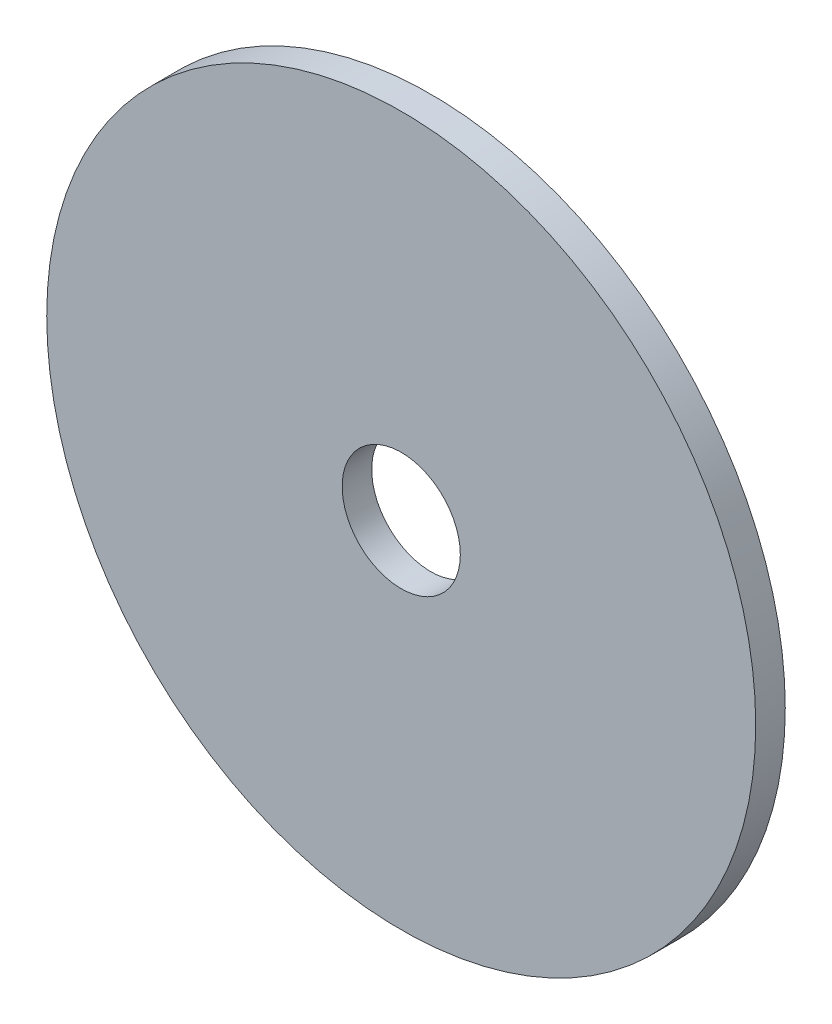
ISO-10303-21;
HEADER;
FILE_DESCRIPTION(('STEP AP214'),'2;1');
FILE_NAME('part.step','',(''),(''),'','','');
FILE_SCHEMA(('AUTOMOTIVE_DESIGN { 1 0 10303 214 1 1 1 1 }'));
ENDSEC;
DATA;
#1=APPLICATION_CONTEXT('core data for automotive mechanical design processes');
#2=APPLICATION_PROTOCOL_DEFINITION('international standard','automotive_design',2000,#1);
#3=PRODUCT_CONTEXT('',#1,'mechanical');
#4=PRODUCT('Part','Part','',(#3));
#5=PRODUCT_RELATED_PRODUCT_CATEGORY('part','',(#4));
#6=PRODUCT_DEFINITION_FORMATION('','',#4);
#7=PRODUCT_DEFINITION_CONTEXT('part definition',#1,'design');
#8=PRODUCT_DEFINITION('design','',#6,#7);
#9=PRODUCT_DEFINITION_SHAPE('','',#8);
#10=(LENGTH_UNIT() NAMED_UNIT(*) SI_UNIT(.MILLI.,.METRE.));
#11=(NAMED_UNIT(*) PLANE_ANGLE_UNIT() SI_UNIT($,.RADIAN.));
#12=(NAMED_UNIT(*) SI_UNIT($,.STERADIAN.) SOLID_ANGLE_UNIT());
#13=UNCERTAINTY_MEASURE_WITH_UNIT(LENGTH_MEASURE(1.E-05),#10,'distance_accuracy_value','');
#14=(GEOMETRIC_REPRESENTATION_CONTEXT(3) GLOBAL_UNCERTAINTY_ASSIGNED_CONTEXT((#13)) GLOBAL_UNIT_ASSIGNED_CONTEXT((#10,
#11,#12)) REPRESENTATION_CONTEXT('',''));
#15=CARTESIAN_POINT('',(0.,0.,0.));
#16=DIRECTION('',(0.,0.,1.));
#17=DIRECTION('',(1.,0.,0.));
#18=AXIS2_PLACEMENT_3D('',#15,#16,#17);
#19=CARTESIAN_POINT('',(0.,0.,3.175));
#20=DIRECTION('',(0.,0.,-1.));
#21=DIRECTION('',(-1.,0.,0.));
#22=AXIS2_PLACEMENT_3D('',#19,#20,#21);
#23=CYLINDRICAL_SURFACE('',#22,38.1);
#24=CARTESIAN_POINT('',(0.,0.,3.175));
#25=DIRECTION('',(0.,0.,1.));
#26=DIRECTION('',(1.,0.,0.));
#27=AXIS2_PLACEMENT_3D('',#24,#25,#26);
#28=CIRCLE('',#27,38.1);
#29=CARTESIAN_POINT('',(38.1,0.,3.175));
#30=VERTEX_POINT('',#29);
#31=EDGE_CURVE('E10',#30,#30,#28,.T.);
#32=ORIENTED_EDGE('',*,*,#31,.F.);
#33=EDGE_LOOP('',(#32));
#34=FACE_BOUND('',#33,.T.);
#35=CARTESIAN_POINT('',(0.,0.,0.));
#36=DIRECTION('',(0.,0.,1.));
#37=DIRECTION('',(1.,0.,0.));
#38=AXIS2_PLACEMENT_3D('',#35,#36,#37);
#39=CIRCLE('',#38,38.1);
#40=CARTESIAN_POINT('',(38.1,0.,0.));
#41=VERTEX_POINT('',#40);
#42=EDGE_CURVE('E40',#41,#41,#39,.T.);
#43=ORIENTED_EDGE('',*,*,#42,.T.);
#44=EDGE_LOOP('',(#43));
#45=FACE_BOUND('',#44,.T.);
#46=ADVANCED_FACE('F37',(#34,#45),#23,.T.);
#47=CARTESIAN_POINT('',(0.,0.,3.175));
#48=DIRECTION('',(0.,0.,1.));
#49=DIRECTION('',(1.,0.,0.));
#50=AXIS2_PLACEMENT_3D('',#47,#48,#49);
#51=PLANE('',#50);
#52=CARTESIAN_POINT('',(0.,0.,3.175));
#53=DIRECTION('',(0.,0.,1.));
#54=DIRECTION('',(1.,0.,0.));
#55=AXIS2_PLACEMENT_3D('',#52,#53,#54);
#56=CIRCLE('',#55,6.35);
#57=CARTESIAN_POINT('',(6.35,0.,3.175));
#58=VERTEX_POINT('',#57);
#59=EDGE_CURVE('E54',#58,#58,#56,.T.);
#60=ORIENTED_EDGE('',*,*,#59,.F.);
#61=EDGE_LOOP('',(#60));
#62=FACE_BOUND('',#61,.T.);
#63=ORIENTED_EDGE('',*,*,#31,.T.);
#64=EDGE_LOOP('',(#63));
#65=FACE_BOUND('',#64,.T.);
#66=ADVANCED_FACE('F62',(#62,#65),#51,.T.);
#67=CARTESIAN_POINT('',(0.,0.,0.));
#68=DIRECTION('',(0.,0.,1.));
#69=DIRECTION('',(1.,0.,0.));
#70=AXIS2_PLACEMENT_3D('',#67,#68,#69);
#71=PLANE('',#70);
#72=CARTESIAN_POINT('',(0.,0.,0.));
#73=DIRECTION('',(0.,0.,1.));
#74=DIRECTION('',(1.,0.,0.));
#75=AXIS2_PLACEMENT_3D('',#72,#73,#74);
#76=CIRCLE('',#75,6.35);
#77=CARTESIAN_POINT('',(6.35,0.,0.));
#78=VERTEX_POINT('',#77);
#79=EDGE_CURVE('E49',#78,#78,#76,.F.);
#80=ORIENTED_EDGE('',*,*,#79,.F.);
#81=EDGE_LOOP('',(#80));
#82=FACE_BOUND('',#81,.T.);
#83=ORIENTED_EDGE('',*,*,#42,.F.);
#84=EDGE_LOOP('',(#83));
#85=FACE_BOUND('',#84,.T.);
#86=ADVANCED_FACE('F64',(#82,#85),#71,.F.);
#87=CARTESIAN_POINT('',(0.,0.,-0.00100000000000013));
#88=DIRECTION('',(0.,0.,1.));
#89=DIRECTION('',(1.,0.,0.));
#90=AXIS2_PLACEMENT_3D('',#87,#88,#89);
#91=CYLINDRICAL_SURFACE('',#90,6.35);
#92=ORIENTED_EDGE('',*,*,#59,.T.);
#93=EDGE_LOOP('',(#92));
#94=FACE_BOUND('',#93,.T.);
#95=ORIENTED_EDGE('',*,*,#79,.T.);
#96=EDGE_LOOP('',(#95));
#97=FACE_BOUND('',#96,.T.);
#98=ADVANCED_FACE('F59',(#94,#97),#91,.F.);
#99=CLOSED_SHELL('',(#46,#66,#86,#98));
#100=MANIFOLD_SOLID_BREP('B2',#99);
#101=ADVANCED_BREP_SHAPE_REPRESENTATION('',(#18,#100),#14);
#102=SHAPE_DEFINITION_REPRESENTATION(#9,#101);
ENDSEC;
END-ISO-10303-21;
